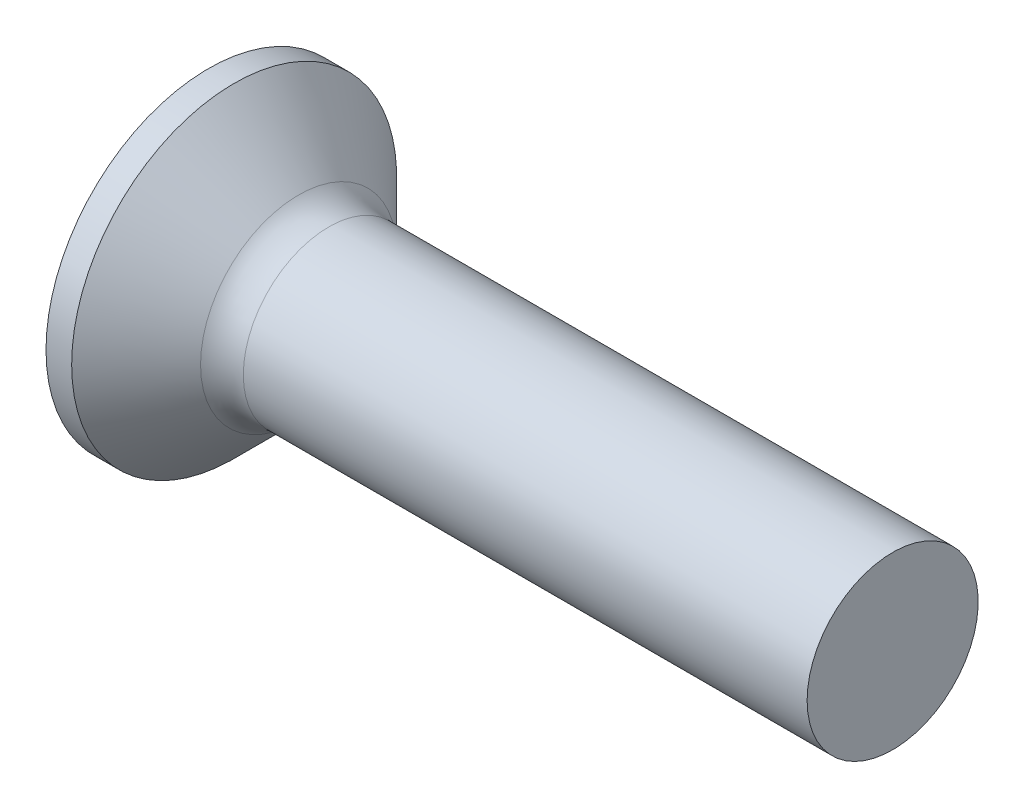
ISO-10303-21;
HEADER;
FILE_DESCRIPTION(('STEP AP214'),'2;1');
FILE_NAME('part.step','',(''),(''),'','','');
FILE_SCHEMA(('AUTOMOTIVE_DESIGN { 1 0 10303 214 1 1 1 1 }'));
ENDSEC;
DATA;
#1=APPLICATION_CONTEXT('core data for automotive mechanical design processes');
#2=APPLICATION_PROTOCOL_DEFINITION('international standard','automotive_design',2000,#1);
#3=PRODUCT_CONTEXT('',#1,'mechanical');
#4=PRODUCT('Part','Part','',(#3));
#5=PRODUCT_RELATED_PRODUCT_CATEGORY('part','',(#4));
#6=PRODUCT_DEFINITION_FORMATION('','',#4);
#7=PRODUCT_DEFINITION_CONTEXT('part definition',#1,'design');
#8=PRODUCT_DEFINITION('design','',#6,#7);
#9=PRODUCT_DEFINITION_SHAPE('','',#8);
#10=(LENGTH_UNIT() NAMED_UNIT(*) SI_UNIT(.MILLI.,.METRE.));
#11=(NAMED_UNIT(*) PLANE_ANGLE_UNIT() SI_UNIT($,.RADIAN.));
#12=(NAMED_UNIT(*) SI_UNIT($,.STERADIAN.) SOLID_ANGLE_UNIT());
#13=UNCERTAINTY_MEASURE_WITH_UNIT(LENGTH_MEASURE(1.E-05),#10,'distance_accuracy_value','');
#14=(GEOMETRIC_REPRESENTATION_CONTEXT(3) GLOBAL_UNCERTAINTY_ASSIGNED_CONTEXT((#13)) GLOBAL_UNIT_ASSIGNED_CONTEXT((#10,
#11,#12)) REPRESENTATION_CONTEXT('',''));
#15=CARTESIAN_POINT('',(0.,0.,0.));
#16=DIRECTION('',(0.,0.,1.));
#17=DIRECTION('',(1.,0.,0.));
#18=AXIS2_PLACEMENT_3D('',#15,#16,#17);
#19=CARTESIAN_POINT('',(0.,0.,0.));
#20=DIRECTION('',(-1.,0.,0.));
#21=DIRECTION('',(0.,0.,0.999999999999998));
#22=AXIS2_PLACEMENT_3D('',#19,#20,#21);
#23=PLANE('',#22);
#24=CARTESIAN_POINT('',(0.,0.,0.));
#25=DIRECTION('',(-1.,0.,0.));
#26=DIRECTION('',(0.,0.,0.999999999999998));
#27=AXIS2_PLACEMENT_3D('',#24,#25,#26);
#28=CIRCLE('',#27,1.9);
#29=CARTESIAN_POINT('',(0.,0.,1.9));
#30=VERTEX_POINT('',#29);
#31=EDGE_CURVE('E355',#30,#30,#28,.T.);
#32=ORIENTED_EDGE('',*,*,#31,.T.);
#33=EDGE_LOOP('',(#32));
#34=FACE_BOUND('',#33,.T.);
#35=DIRECTION('',(0.,0.,-0.999999999999999));
#36=VECTOR('',#35,1.);
#37=CARTESIAN_POINT('',(0.,-0.240000000000025,0.950000000000034));
#38=LINE('',#37,#36);
#39=CARTESIAN_POINT('',(0.,-0.240000000000025,0.950000000000034));
#40=VERTEX_POINT('',#39);
#41=CARTESIAN_POINT('',(0.,-0.240000000000004,0.368080234393747));
#42=VERTEX_POINT('',#41);
#43=EDGE_CURVE('E394',#40,#42,#38,.T.);
#44=ORIENTED_EDGE('',*,*,#43,.T.);
#45=CARTESIAN_POINT('',(0.,0.,0.));
#46=DIRECTION('',(-1.,0.,0.));
#47=DIRECTION('',(0.,0.,0.999999999999998));
#48=AXIS2_PLACEMENT_3D('',#45,#46,#47);
#49=CIRCLE('',#48,0.439412174332203);
#50=CARTESIAN_POINT('',(0.,-0.368080234393747,0.240000000000004));
#51=VERTEX_POINT('',#50);
#52=EDGE_CURVE('E381',#51,#42,#49,.T.);
#53=ORIENTED_EDGE('',*,*,#52,.F.);
#54=DIRECTION('',(0.,-0.999999999999999,0.));
#55=VECTOR('',#54,1.);
#56=CARTESIAN_POINT('',(0.,0.949999999999951,0.240000000000073));
#57=LINE('',#56,#55);
#58=CARTESIAN_POINT('',(0.,-0.950000000000076,0.240000000000087));
#59=VERTEX_POINT('',#58);
#60=EDGE_CURVE('E441',#51,#59,#57,.T.);
#61=ORIENTED_EDGE('',*,*,#60,.T.);
#62=DIRECTION('',(0.,0.,-0.999999999999998));
#63=VECTOR('',#62,1.);
#64=CARTESIAN_POINT('',(0.,-0.950000000000076,0.240000000000087));
#65=LINE('',#64,#63);
#66=CARTESIAN_POINT('',(0.,-0.950000000000041,-0.239999999999851));
#67=VERTEX_POINT('',#66);
#68=EDGE_CURVE('E352',#59,#67,#65,.T.);
#69=ORIENTED_EDGE('',*,*,#68,.T.);
#70=DIRECTION('',(0.,0.999999999999998,0.));
#71=VECTOR('',#70,1.);
#72=CARTESIAN_POINT('',(0.,-0.950000000000041,-0.239999999999851));
#73=LINE('',#72,#71);
#74=CARTESIAN_POINT('',(0.,-0.368080234393747,-0.23999999999999));
#75=VERTEX_POINT('',#74);
#76=EDGE_CURVE('E442',#67,#75,#73,.T.);
#77=ORIENTED_EDGE('',*,*,#76,.T.);
#78=CARTESIAN_POINT('',(0.,-0.240000000000046,-0.368080234393595));
#79=VERTEX_POINT('',#78);
#80=EDGE_CURVE('E387',#79,#75,#49,.T.);
#81=ORIENTED_EDGE('',*,*,#80,.F.);
#82=CARTESIAN_POINT('',(0.,-0.240000000000073,-0.949999999999881));
#83=VERTEX_POINT('',#82);
#84=EDGE_CURVE('E403',#79,#83,#38,.T.);
#85=ORIENTED_EDGE('',*,*,#84,.T.);
#86=DIRECTION('',(0.,0.999999999999998,0.));
#87=VECTOR('',#86,1.);
#88=CARTESIAN_POINT('',(0.,-0.240000000000073,-0.949999999999881));
#89=LINE('',#88,#87);
#90=CARTESIAN_POINT('',(0.,0.239999999999942,-0.94999999999984));
#91=VERTEX_POINT('',#90);
#92=EDGE_CURVE('E402',#83,#91,#89,.T.);
#93=ORIENTED_EDGE('',*,*,#92,.T.);
#94=DIRECTION('',(0.,0.,0.999999999999998));
#95=VECTOR('',#94,1.);
#96=CARTESIAN_POINT('',(0.,0.239999999999942,-0.94999999999984));
#97=LINE('',#96,#95);
#98=CARTESIAN_POINT('',(0.,0.239999999999949,-0.368080234393595));
#99=VERTEX_POINT('',#98);
#100=EDGE_CURVE('E409',#91,#99,#97,.T.);
#101=ORIENTED_EDGE('',*,*,#100,.T.);
#102=CARTESIAN_POINT('',(0.,0.368080234393706,-0.239999999999962));
#103=VERTEX_POINT('',#102);
#104=EDGE_CURVE('E477',#103,#99,#49,.T.);
#105=ORIENTED_EDGE('',*,*,#104,.F.);
#106=CARTESIAN_POINT('',(0.,0.94999999999993,-0.239999999999907));
#107=VERTEX_POINT('',#106);
#108=EDGE_CURVE('E450',#103,#107,#73,.T.);
#109=ORIENTED_EDGE('',*,*,#108,.T.);
#110=DIRECTION('',(0.,0.,0.999999999999998));
#111=VECTOR('',#110,1.);
#112=CARTESIAN_POINT('',(0.,0.94999999999993,-0.239999999999907));
#113=LINE('',#112,#111);
#114=CARTESIAN_POINT('',(0.,0.949999999999951,0.240000000000073));
#115=VERTEX_POINT('',#114);
#116=EDGE_CURVE('E438',#107,#115,#113,.T.);
#117=ORIENTED_EDGE('',*,*,#116,.T.);
#118=CARTESIAN_POINT('',(0.,0.368080234393706,0.240000000000046));
#119=VERTEX_POINT('',#118);
#120=EDGE_CURVE('E443',#115,#119,#57,.T.);
#121=ORIENTED_EDGE('',*,*,#120,.T.);
#122=CARTESIAN_POINT('',(0.,0.239999999999962,0.368080234393858));
#123=VERTEX_POINT('',#122);
#124=EDGE_CURVE('E389',#123,#119,#49,.T.);
#125=ORIENTED_EDGE('',*,*,#124,.F.);
#126=CARTESIAN_POINT('',(0.,0.239999999999976,0.950000000000159));
#127=VERTEX_POINT('',#126);
#128=EDGE_CURVE('E412',#123,#127,#97,.T.);
#129=ORIENTED_EDGE('',*,*,#128,.T.);
#130=DIRECTION('',(0.,-0.999999999999998,0.));
#131=VECTOR('',#130,1.);
#132=CARTESIAN_POINT('',(0.,0.239999999999976,0.950000000000159));
#133=LINE('',#132,#131);
#134=EDGE_CURVE('E401',#127,#40,#133,.T.);
#135=ORIENTED_EDGE('',*,*,#134,.T.);
#136=EDGE_LOOP('',(#44,#53,#61,#69,#77,#81,#85,#93,#101,#105,#109,#117,#121,#125,#129,#135));
#137=FACE_BOUND('',#136,.T.);
#138=ADVANCED_FACE('F48',(#34,#137),#23,.T.);
#139=CARTESIAN_POINT('',(1.2,-0.351702090980288,0.240000000000129));
#140=DIRECTION('',(0.,0.,-0.999999999999998));
#141=DIRECTION('',(-1.,0.,0.));
#142=AXIS2_PLACEMENT_3D('',#139,#140,#141);
#143=PLANE('',#142);
#144=ORIENTED_EDGE('',*,*,#60,.F.);
#145=CARTESIAN_POINT('',(-0.647693210410766,-0.421114336989034,0.240000000000157));
#146=CARTESIAN_POINT('',(-0.514503449530125,-0.410390261082066,0.240000000000117));
#147=CARTESIAN_POINT('',(-0.381320940222118,-0.399574318209556,0.240000000000118));
#148=CARTESIAN_POINT('',(-0.114973765651321,-0.377686644383797,0.240000000000139));
#149=CARTESIAN_POINT('',(0.0181908991098717,-0.366614907333412,0.240000000000159));
#150=CARTESIAN_POINT('',(0.284492634009299,-0.344144100394447,0.240000000000155));
#151=CARTESIAN_POINT('',(0.417629704158505,-0.332745030636268,0.240000000000132));
#152=CARTESIAN_POINT('',(0.683863247571623,-0.30950412250851,0.240000000000126));
#153=CARTESIAN_POINT('',(0.81695972144959,-0.297662291208926,0.240000000000144));
#154=CARTESIAN_POINT('',(1.04303435436914,-0.27701015453556,0.240000000000142));
#155=CARTESIAN_POINT('',(1.13602713244053,-0.268360479227187,0.240000000000132));
#156=CARTESIAN_POINT('',(1.3219725581858,-0.250648380042532,0.240000000000126));
#157=CARTESIAN_POINT('',(1.41492520621452,-0.241585959894602,0.240000000000129));
#158=CARTESIAN_POINT('',(1.60078125424124,-0.222904447219513,0.240000000000129));
#159=CARTESIAN_POINT('',(1.6936846508529,-0.213285320436343,0.240000000000127));
#160=CARTESIAN_POINT('',(1.87939874418318,-0.193166747196788,0.240000000000131));
#161=CARTESIAN_POINT('',(1.97220943765283,-0.182667270911502,0.240000000000138));
#162=CARTESIAN_POINT('',(2.06495176785102,-0.171565852394709,0.240000000000157));
#163=B_SPLINE_CURVE_WITH_KNOTS('',3,(#145,#146,#147,#148,#149,#150,#151,#152,#153,#154,#155,
#156,#157,#158,#159,#160,#161,#162),.UNSPECIFIED.,.F.,.F.,(4,2,2,2,2,2,2,2,4),(0.,
0.400862588720511,0.801734742318301,1.20260673621982,1.60347233174809,1.88365413958717,
2.16383341702736,2.44402995319874,2.72423598711459),.UNSPECIFIED.);
#164=CARTESIAN_POINT('',(1.2,-0.262259890185322,0.240000000000143));
#165=VERTEX_POINT('',#164);
#166=EDGE_CURVE('E384',#51,#165,#163,.T.);
#167=ORIENTED_EDGE('',*,*,#166,.T.);
#168=DIRECTION('',(0.,-0.999999999999998,0.));
#169=VECTOR('',#168,1.);
#170=CARTESIAN_POINT('',(1.2,0.351702090980129,0.240000000000073));
#171=LINE('',#170,#169);
#172=CARTESIAN_POINT('',(1.2,-0.351702090980288,0.240000000000129));
#173=VERTEX_POINT('',#172);
#174=EDGE_CURVE('E457',#165,#173,#171,.T.);
#175=ORIENTED_EDGE('',*,*,#174,.T.);
#176=DIRECTION('',(0.894934367749961,0.446197800778957,0.));
#177=VECTOR('',#176,1.);
#178=CARTESIAN_POINT('',(0.,-0.950000000000076,0.240000000000087));
#179=LINE('',#178,#177);
#180=EDGE_CURVE('E330',#59,#173,#179,.T.);
#181=ORIENTED_EDGE('',*,*,#180,.F.);
#182=EDGE_LOOP('',(#144,#167,#175,#181));
#183=FACE_BOUND('',#182,.T.);
#184=ADVANCED_FACE('F202',(#183),#143,.T.);
#185=CARTESIAN_POINT('',(1.2,0.351702090980129,0.240000000000073));
#186=VERTEX_POINT('',#185);
#187=CARTESIAN_POINT('',(1.2,0.26225989018526,0.240000000000143));
#188=VERTEX_POINT('',#187);
#189=EDGE_CURVE('E339',#186,#188,#171,.T.);
#190=ORIENTED_EDGE('',*,*,#189,.T.);
#191=CARTESIAN_POINT('',(-0.647693210410766,0.421114336988979,0.240000000000157));
#192=CARTESIAN_POINT('',(-0.514503449530114,0.410390261082132,0.240000000000148));
#193=CARTESIAN_POINT('',(-0.381320940222108,0.399574318209602,0.240000000000137));
#194=CARTESIAN_POINT('',(-0.114973765651318,0.377686644383749,0.24000000000012));
#195=CARTESIAN_POINT('',(0.0181908991098696,0.366614907333292,0.240000000000114));
#196=CARTESIAN_POINT('',(0.284492634009301,0.344144100394359,0.240000000000117));
#197=CARTESIAN_POINT('',(0.417629704158516,0.332745030636285,0.240000000000125));
#198=CARTESIAN_POINT('',(0.683863247571632,0.309504122508492,0.240000000000132));
#199=CARTESIAN_POINT('',(0.816959721449587,0.297662291208768,0.24000000000013));
#200=CARTESIAN_POINT('',(1.04303435436914,0.277010154535435,0.240000000000128));
#201=CARTESIAN_POINT('',(1.13602713244054,0.268360479227153,0.240000000000129));
#202=CARTESIAN_POINT('',(1.32197255818581,0.250648380042564,0.240000000000129));
#203=CARTESIAN_POINT('',(1.41492520621453,0.241585959894609,0.24000000000013));
#204=CARTESIAN_POINT('',(1.60078125424124,0.222904447219503,0.240000000000128));
#205=CARTESIAN_POINT('',(1.69368465085291,0.213285320436341,0.240000000000126));
#206=CARTESIAN_POINT('',(1.87939874418319,0.193166747196789,0.240000000000132));
#207=CARTESIAN_POINT('',(1.97220943765283,0.182667270911499,0.240000000000139));
#208=CARTESIAN_POINT('',(2.06495176785102,0.171565852394674,0.240000000000157));
#209=B_SPLINE_CURVE_WITH_KNOTS('',3,(#191,#192,#193,#194,#195,#196,#197,#198,#199,#200,#201,
#202,#203,#204,#205,#206,#207,#208),.UNSPECIFIED.,.F.,.F.,(4,2,2,2,2,2,2,2,4),(0.,
0.400862588720514,0.801734742318306,1.20260673621982,1.60347233174809,1.88365413958718,
2.16383341702737,2.44402995319874,2.72423598711459),.UNSPECIFIED.);
#210=EDGE_CURVE('E262',#188,#119,#209,.F.);
#211=ORIENTED_EDGE('',*,*,#210,.T.);
#212=ORIENTED_EDGE('',*,*,#120,.F.);
#213=DIRECTION('',(0.89493436774996,-0.446197800778958,0.));
#214=VECTOR('',#213,1.);
#215=CARTESIAN_POINT('',(0.,0.949999999999951,0.240000000000073));
#216=LINE('',#215,#214);
#217=EDGE_CURVE('E71',#115,#186,#216,.T.);
#218=ORIENTED_EDGE('',*,*,#217,.T.);
#219=EDGE_LOOP('',(#190,#211,#212,#218));
#220=FACE_BOUND('',#219,.T.);
#221=ADVANCED_FACE('F207',(#220),#143,.T.);
#222=CARTESIAN_POINT('',(1.2,0.351702090980177,-0.239999999999851));
#223=DIRECTION('',(0.,0.,0.999999999999998));
#224=DIRECTION('',(1.,0.,0.));
#225=AXIS2_PLACEMENT_3D('',#222,#223,#224);
#226=PLANE('',#225);
#227=DIRECTION('',(0.,0.999999999999998,0.));
#228=VECTOR('',#227,1.);
#229=CARTESIAN_POINT('',(1.2,-0.351702090980219,-0.239999999999949));
#230=LINE('',#229,#228);
#231=CARTESIAN_POINT('',(1.2,-0.351702090980219,-0.239999999999949));
#232=VERTEX_POINT('',#231);
#233=CARTESIAN_POINT('',(1.2,-0.262259890185343,-0.239999999999935));
#234=VERTEX_POINT('',#233);
#235=EDGE_CURVE('E343',#232,#234,#230,.T.);
#236=ORIENTED_EDGE('',*,*,#235,.T.);
#237=CARTESIAN_POINT('',(-0.647693210410766,-0.421114336989083,-0.239999999999879));
#238=CARTESIAN_POINT('',(-0.514503449530105,-0.410390261082349,-0.239999999999857));
#239=CARTESIAN_POINT('',(-0.3813209402221,-0.399574318209808,-0.239999999999851));
#240=CARTESIAN_POINT('',(-0.114973765651315,-0.377686644383886,-0.23999999999985));
#241=CARTESIAN_POINT('',(0.0181908991098679,-0.366614907333371,-0.239999999999854));
#242=CARTESIAN_POINT('',(0.284492634009302,-0.344144100394475,-0.239999999999848));
#243=CARTESIAN_POINT('',(0.417629704158526,-0.332745030636496,-0.239999999999838));
#244=CARTESIAN_POINT('',(0.68386324757164,-0.309504122508695,-0.239999999999864));
#245=CARTESIAN_POINT('',(0.816959721449585,-0.297662291208868,-0.239999999999901));
#246=CARTESIAN_POINT('',(1.04303435436914,-0.277010154535577,-0.239999999999888));
#247=CARTESIAN_POINT('',(1.13602713244055,-0.268360479227375,-0.239999999999861));
#248=CARTESIAN_POINT('',(1.32197255818583,-0.250648380042852,-0.239999999999842));
#249=CARTESIAN_POINT('',(1.41492520621455,-0.241585959894883,-0.239999999999849));
#250=CARTESIAN_POINT('',(1.60078125424126,-0.222904447219799,-0.239999999999854));
#251=CARTESIAN_POINT('',(1.69368465085293,-0.213285320436674,-0.23999999999985));
#252=CARTESIAN_POINT('',(1.87939874418321,-0.193166747197106,-0.239999999999853));
#253=CARTESIAN_POINT('',(1.97220943765285,-0.182667270911764,-0.239999999999859));
#254=CARTESIAN_POINT('',(2.06495176785102,-0.171565852394771,-0.239999999999879));
#255=B_SPLINE_CURVE_WITH_KNOTS('',3,(#237,#238,#239,#240,#241,#242,#243,#244,#245,#246,#247,
#248,#249,#250,#251,#252,#253,#254),.UNSPECIFIED.,.F.,.F.,(4,2,2,2,2,2,2,2,4),(0.,
0.400862588720514,0.801734742318306,1.20260673621982,1.60347233174809,1.88365413958718,
2.16383341702737,2.44402995319874,2.72423598711459),.UNSPECIFIED.);
#256=EDGE_CURVE('E256',#234,#75,#255,.F.);
#257=ORIENTED_EDGE('',*,*,#256,.T.);
#258=ORIENTED_EDGE('',*,*,#76,.F.);
#259=DIRECTION('',(0.894934367749961,0.446197800778957,0.));
#260=VECTOR('',#259,1.);
#261=CARTESIAN_POINT('',(0.,-0.950000000000041,-0.239999999999851));
#262=LINE('',#261,#260);
#263=EDGE_CURVE('E452',#67,#232,#262,.T.);
#264=ORIENTED_EDGE('',*,*,#263,.T.);
#265=EDGE_LOOP('',(#236,#257,#258,#264));
#266=FACE_BOUND('',#265,.T.);
#267=ADVANCED_FACE('F242',(#266),#226,.T.);
#268=ORIENTED_EDGE('',*,*,#108,.F.);
#269=CARTESIAN_POINT('',(-0.647693210410766,0.421114336988979,-0.239999999999851));
#270=CARTESIAN_POINT('',(-0.514503449530098,0.41039026108234,-0.239999999999739));
#271=CARTESIAN_POINT('',(-0.381320940222093,0.399574318209815,-0.239999999999783));
#272=CARTESIAN_POINT('',(-0.114973765651311,0.377686644383878,-0.239999999999918));
#273=CARTESIAN_POINT('',(0.0181908991098684,0.366614907333333,-0.240000000000009));
#274=CARTESIAN_POINT('',(0.284492634009303,0.344144100394443,-0.239999999999971));
#275=CARTESIAN_POINT('',(0.41762970415853,0.332745030636501,-0.239999999999842));
#276=CARTESIAN_POINT('',(0.683863247571643,0.309504122508688,-0.23999999999986));
#277=CARTESIAN_POINT('',(0.816959721449584,0.297662291208812,-0.240000000000008));
#278=CARTESIAN_POINT('',(1.04303435436914,0.277010154535534,-0.239999999999978));
#279=CARTESIAN_POINT('',(1.13602713244055,0.268360479227364,-0.239999999999886));
#280=CARTESIAN_POINT('',(1.32197255818584,0.250648380042863,-0.239999999999817));
#281=CARTESIAN_POINT('',(1.41492520621456,0.241585959894883,-0.239999999999842));
#282=CARTESIAN_POINT('',(1.60078125424127,0.222904447219798,-0.239999999999861));
#283=CARTESIAN_POINT('',(1.69368465085294,0.213285320436682,-0.239999999999857));
#284=CARTESIAN_POINT('',(1.87939874418322,0.193166747197095,-0.239999999999847));
#285=CARTESIAN_POINT('',(1.97220943765285,0.182667270911724,-0.239999999999842));
#286=CARTESIAN_POINT('',(2.06495176785102,0.171565852394653,-0.239999999999851));
#287=B_SPLINE_CURVE_WITH_KNOTS('',3,(#269,#270,#271,#272,#273,#274,#275,#276,#277,#278,#279,
#280,#281,#282,#283,#284,#285,#286),.UNSPECIFIED.,.F.,.F.,(4,2,2,2,2,2,2,2,4),(0.,
0.400862588720511,0.801734742318301,1.20260673621982,1.60347233174809,1.88365413958718,
2.16383341702737,2.44402995319874,2.7242359871146),.UNSPECIFIED.);
#288=CARTESIAN_POINT('',(1.2,0.262259890185246,-0.239999999999935));
#289=VERTEX_POINT('',#288);
#290=EDGE_CURVE('E250',#103,#289,#287,.T.);
#291=ORIENTED_EDGE('',*,*,#290,.T.);
#292=CARTESIAN_POINT('',(1.2,0.351702090980177,-0.239999999999851));
#293=VERTEX_POINT('',#292);
#294=EDGE_CURVE('E347',#289,#293,#230,.T.);
#295=ORIENTED_EDGE('',*,*,#294,.T.);
#296=DIRECTION('',(0.89493436774996,-0.446197800778958,0.));
#297=VECTOR('',#296,1.);
#298=CARTESIAN_POINT('',(0.,0.94999999999993,-0.239999999999907));
#299=LINE('',#298,#297);
#300=EDGE_CURVE('E334',#107,#293,#299,.T.);
#301=ORIENTED_EDGE('',*,*,#300,.F.);
#302=EDGE_LOOP('',(#268,#291,#295,#301));
#303=FACE_BOUND('',#302,.T.);
#304=ADVANCED_FACE('F234',(#303),#226,.T.);
#305=CARTESIAN_POINT('',(1.2,0.351702090980177,-0.239999999999851));
#306=DIRECTION('',(1.,0.,0.));
#307=DIRECTION('',(0.,0.,-0.999999999999998));
#308=AXIS2_PLACEMENT_3D('',#305,#306,#307);
#309=PLANE('',#308);
#310=CARTESIAN_POINT('',(1.2,0.,0.));
#311=DIRECTION('',(-1.,0.,0.));
#312=DIRECTION('',(0.,0.,0.999999999999998));
#313=AXIS2_PLACEMENT_3D('',#310,#311,#312);
#314=CIRCLE('',#313,0.355499999999999);
#315=CARTESIAN_POINT('',(1.2,-0.0518255651213995,-0.351702090980108));
#316=VERTEX_POINT('',#315);
#317=CARTESIAN_POINT('',(1.2,-0.240000000000018,-0.262259890185176));
#318=VERTEX_POINT('',#317);
#319=EDGE_CURVE('E524',#316,#318,#314,.T.);
#320=ORIENTED_EDGE('',*,*,#319,.F.);
#321=DIRECTION('',(0.,0.999999999999998,0.));
#322=VECTOR('',#321,1.);
#323=CARTESIAN_POINT('',(1.2,-0.24000000000006,-0.351702090980094));
#324=LINE('',#323,#322);
#325=CARTESIAN_POINT('',(1.2,-0.24000000000006,-0.351702090980094));
#326=VERTEX_POINT('',#325);
#327=EDGE_CURVE('E424',#326,#316,#324,.T.);
#328=ORIENTED_EDGE('',*,*,#327,.F.);
#329=DIRECTION('',(0.,0.,-0.999999999999999));
#330=VECTOR('',#329,1.);
#331=CARTESIAN_POINT('',(1.2,-0.240000000000004,0.351702090980219));
#332=LINE('',#331,#330);
#333=EDGE_CURVE('E428',#318,#326,#332,.T.);
#334=ORIENTED_EDGE('',*,*,#333,.F.);
#335=EDGE_LOOP('',(#320,#328,#334));
#336=FACE_BOUND('',#335,.T.);
#337=ADVANCED_FACE('F230',(#336),#309,.F.);
#338=CARTESIAN_POINT('',(1.2,-0.351702090980247,-0.0518255651211913));
#339=VERTEX_POINT('',#338);
#340=EDGE_CURVE('E495',#234,#339,#314,.T.);
#341=ORIENTED_EDGE('',*,*,#340,.F.);
#342=ORIENTED_EDGE('',*,*,#235,.F.);
#343=DIRECTION('',(0.,0.,-0.999999999999998));
#344=VECTOR('',#343,1.);
#345=CARTESIAN_POINT('',(1.2,-0.351702090980288,0.240000000000129));
#346=LINE('',#345,#344);
#347=EDGE_CURVE('E335',#339,#232,#346,.T.);
#348=ORIENTED_EDGE('',*,*,#347,.F.);
#349=EDGE_LOOP('',(#341,#342,#348));
#350=FACE_BOUND('',#349,.T.);
#351=ADVANCED_FACE('F233',(#350),#309,.F.);
#352=CARTESIAN_POINT('',(1.2,-0.351702090980247,0.051825565121455));
#353=VERTEX_POINT('',#352);
#354=EDGE_CURVE('E491',#353,#165,#314,.T.);
#355=ORIENTED_EDGE('',*,*,#354,.F.);
#356=EDGE_CURVE('E325',#173,#353,#346,.T.);
#357=ORIENTED_EDGE('',*,*,#356,.F.);
#358=ORIENTED_EDGE('',*,*,#174,.F.);
#359=EDGE_LOOP('',(#355,#357,#358));
#360=FACE_BOUND('',#359,.T.);
#361=ADVANCED_FACE('F489',(#360),#309,.F.);
#362=CARTESIAN_POINT('',(1.2,-0.240000000000004,0.262259890185371));
#363=VERTEX_POINT('',#362);
#364=CARTESIAN_POINT('',(1.2,-0.0518255651213578,0.351702090980219));
#365=VERTEX_POINT('',#364);
#366=EDGE_CURVE('E63',#363,#365,#314,.T.);
#367=ORIENTED_EDGE('',*,*,#366,.F.);
#368=CARTESIAN_POINT('',(1.2,-0.240000000000004,0.351702090980219));
#369=VERTEX_POINT('',#368);
#370=EDGE_CURVE('E397',#369,#363,#332,.T.);
#371=ORIENTED_EDGE('',*,*,#370,.F.);
#372=DIRECTION('',(0.,-0.999999999999998,0.));
#373=VECTOR('',#372,1.);
#374=CARTESIAN_POINT('',(1.2,0.239999999999962,0.351702090980344));
#375=LINE('',#374,#373);
#376=EDGE_CURVE('E429',#365,#369,#375,.T.);
#377=ORIENTED_EDGE('',*,*,#376,.F.);
#378=EDGE_LOOP('',(#367,#371,#377));
#379=FACE_BOUND('',#378,.T.);
#380=ADVANCED_FACE('F535',(#379),#309,.F.);
#381=CARTESIAN_POINT('',(1.2,0.0518255651213093,0.351702090980358));
#382=VERTEX_POINT('',#381);
#383=CARTESIAN_POINT('',(1.2,0.239999999999976,0.262259890185329));
#384=VERTEX_POINT('',#383);
#385=EDGE_CURVE('E388',#382,#384,#314,.T.);
#386=ORIENTED_EDGE('',*,*,#385,.F.);
#387=CARTESIAN_POINT('',(1.2,0.239999999999962,0.351702090980344));
#388=VERTEX_POINT('',#387);
#389=EDGE_CURVE('E425',#388,#382,#375,.T.);
#390=ORIENTED_EDGE('',*,*,#389,.F.);
#391=DIRECTION('',(0.,0.,0.999999999999998));
#392=VECTOR('',#391,1.);
#393=CARTESIAN_POINT('',(1.2,0.239999999999962,-0.351702090980066));
#394=LINE('',#393,#392);
#395=EDGE_CURVE('E437',#384,#388,#394,.T.);
#396=ORIENTED_EDGE('',*,*,#395,.F.);
#397=EDGE_LOOP('',(#386,#390,#396));
#398=FACE_BOUND('',#397,.T.);
#399=ADVANCED_FACE('F500',(#398),#309,.F.);
#400=CARTESIAN_POINT('',(1.2,0.351702090980191,0.0518255651213995));
#401=VERTEX_POINT('',#400);
#402=EDGE_CURVE('E469',#188,#401,#314,.T.);
#403=ORIENTED_EDGE('',*,*,#402,.F.);
#404=ORIENTED_EDGE('',*,*,#189,.F.);
#405=DIRECTION('',(0.,0.,0.999999999999998));
#406=VECTOR('',#405,1.);
#407=CARTESIAN_POINT('',(1.2,0.351702090980177,-0.239999999999851));
#408=LINE('',#407,#406);
#409=EDGE_CURVE('E346',#401,#186,#408,.T.);
#410=ORIENTED_EDGE('',*,*,#409,.F.);
#411=EDGE_LOOP('',(#403,#404,#410));
#412=FACE_BOUND('',#411,.T.);
#413=ADVANCED_FACE('F467',(#412),#309,.F.);
#414=CARTESIAN_POINT('',(1.2,0.351702090980205,-0.0518255651213023));
#415=VERTEX_POINT('',#414);
#416=EDGE_CURVE('E475',#415,#289,#314,.T.);
#417=ORIENTED_EDGE('',*,*,#416,.F.);
#418=EDGE_CURVE('E455',#293,#415,#408,.T.);
#419=ORIENTED_EDGE('',*,*,#418,.F.);
#420=ORIENTED_EDGE('',*,*,#294,.F.);
#421=EDGE_LOOP('',(#417,#419,#420));
#422=FACE_BOUND('',#421,.T.);
#423=ADVANCED_FACE('F319',(#422),#309,.F.);
#424=CARTESIAN_POINT('',(1.2,0.239999999999935,-0.26225989018519));
#425=VERTEX_POINT('',#424);
#426=CARTESIAN_POINT('',(1.2,0.051825565121344,-0.351702090980177));
#427=VERTEX_POINT('',#426);
#428=EDGE_CURVE('E518',#425,#427,#314,.T.);
#429=ORIENTED_EDGE('',*,*,#428,.F.);
#430=CARTESIAN_POINT('',(1.2,0.239999999999962,-0.351702090980066));
#431=VERTEX_POINT('',#430);
#432=EDGE_CURVE('E434',#431,#425,#394,.T.);
#433=ORIENTED_EDGE('',*,*,#432,.F.);
#434=EDGE_CURVE('E431',#427,#431,#324,.T.);
#435=ORIENTED_EDGE('',*,*,#434,.F.);
#436=EDGE_LOOP('',(#429,#433,#435));
#437=FACE_BOUND('',#436,.T.);
#438=ADVANCED_FACE('F236',(#437),#309,.F.);
#439=CARTESIAN_POINT('',(1.2,-0.351702090980219,-0.239999999999949));
#440=DIRECTION('',(-0.446197800778957,0.894934367749959,0.));
#441=DIRECTION('',(-0.894934367749961,-0.446197800778957,0.));
#442=AXIS2_PLACEMENT_3D('',#439,#440,#441);
#443=PLANE('',#442);
#444=ORIENTED_EDGE('',*,*,#356,.T.);
#445=CARTESIAN_POINT('',(1.81755030037573,-0.0438028797890982,0.));
#446=DIRECTION('',(-0.446197800778957,0.894934367749959,0.));
#447=DIRECTION('',(-0.894934367749961,-0.446197800778957,0.));
#448=AXIS2_PLACEMENT_3D('',#445,#446,#447);
#449=ELLIPSE('',#448,0.699951178008363,0.309229710740658);
#450=EDGE_CURVE('E326',#353,#339,#449,.F.);
#451=ORIENTED_EDGE('',*,*,#450,.T.);
#452=ORIENTED_EDGE('',*,*,#347,.T.);
#453=ORIENTED_EDGE('',*,*,#263,.F.);
#454=ORIENTED_EDGE('',*,*,#68,.F.);
#455=ORIENTED_EDGE('',*,*,#180,.T.);
#456=EDGE_LOOP('',(#444,#451,#452,#453,#454,#455));
#457=FACE_BOUND('',#456,.T.);
#458=ADVANCED_FACE('F241',(#457),#443,.T.);
#459=CARTESIAN_POINT('',(0.,0.949999999999951,0.240000000000073));
#460=DIRECTION('',(-0.446197800778958,-0.894934367749959,0.));
#461=DIRECTION('',(0.89493436774996,-0.446197800778958,0.));
#462=AXIS2_PLACEMENT_3D('',#459,#460,#461);
#463=PLANE('',#462);
#464=ORIENTED_EDGE('',*,*,#418,.T.);
#465=CARTESIAN_POINT('',(1.81755030037573,0.043802879789015,1.11022302462516E-13));
#466=DIRECTION('',(-0.446197800778958,-0.894934367749959,0.));
#467=DIRECTION('',(-0.89493436774996,0.446197800778958,0.));
#468=AXIS2_PLACEMENT_3D('',#465,#466,#467);
#469=ELLIPSE('',#468,0.699951178008361,0.309229710740658);
#470=EDGE_CURVE('E303',#415,#401,#469,.F.);
#471=ORIENTED_EDGE('',*,*,#470,.T.);
#472=ORIENTED_EDGE('',*,*,#409,.T.);
#473=ORIENTED_EDGE('',*,*,#217,.F.);
#474=ORIENTED_EDGE('',*,*,#116,.F.);
#475=ORIENTED_EDGE('',*,*,#300,.T.);
#476=EDGE_LOOP('',(#464,#471,#472,#473,#474,#475));
#477=FACE_BOUND('',#476,.T.);
#478=ADVANCED_FACE('F237',(#477),#463,.T.);
#479=CARTESIAN_POINT('',(1.2,0.239999999999962,0.351702090980344));
#480=DIRECTION('',(0.,-0.999999999999998,0.));
#481=DIRECTION('',(1.,0.,0.));
#482=AXIS2_PLACEMENT_3D('',#479,#480,#481);
#483=PLANE('',#482);
#484=ORIENTED_EDGE('',*,*,#432,.T.);
#485=CARTESIAN_POINT('',(-0.647693210410766,0.239999999999976,-0.421114336988965));
#486=CARTESIAN_POINT('',(-0.514503449530096,0.239999999999966,-0.410390261082335));
#487=CARTESIAN_POINT('',(-0.381320940222091,0.239999999999964,-0.399574318209778));
#488=CARTESIAN_POINT('',(-0.114973765651311,0.239999999999965,-0.377686644383774));
#489=CARTESIAN_POINT('',(0.0181908991098664,0.239999999999968,-0.366614907333193));
#490=CARTESIAN_POINT('',(0.284492634009302,0.239999999999971,-0.344144100394306));
#491=CARTESIAN_POINT('',(0.417629704158532,0.239999999999971,-0.332745030636402));
#492=CARTESIAN_POINT('',(0.683863247571646,0.239999999999958,-0.309504122508617));
#493=CARTESIAN_POINT('',(0.816959721449586,0.239999999999945,-0.29766229120873));
#494=CARTESIAN_POINT('',(1.04303435436914,0.239999999999951,-0.277010154535438));
#495=CARTESIAN_POINT('',(1.13602713244055,0.239999999999961,-0.268360479227263));
#496=CARTESIAN_POINT('',(1.32197255818584,0.239999999999968,-0.250648380042754));
#497=CARTESIAN_POINT('',(1.41492520621455,0.239999999999966,-0.241585959894771));
#498=CARTESIAN_POINT('',(1.60078125424127,0.239999999999964,-0.222904447219676));
#499=CARTESIAN_POINT('',(1.69368465085294,0.239999999999964,-0.213285320436553));
#500=CARTESIAN_POINT('',(1.87939874418322,0.239999999999965,-0.193166747196959));
#501=CARTESIAN_POINT('',(1.97220943765285,0.239999999999965,-0.182667270911588));
#502=CARTESIAN_POINT('',(2.06495176785102,0.239999999999962,-0.171565852394528));
#503=B_SPLINE_CURVE_WITH_KNOTS('',3,(#485,#486,#487,#488,#489,#490,#491,#492,#493,#494,#495,
#496,#497,#498,#499,#500,#501,#502),.UNSPECIFIED.,.F.,.F.,(4,2,2,2,2,2,2,2,4),(0.,
0.400862588720516,0.801734742318311,1.20260673621983,1.60347233174809,1.88365413958718,
2.16383341702738,2.44402995319875,2.72423598711461),.UNSPECIFIED.);
#504=EDGE_CURVE('E296',#425,#99,#503,.F.);
#505=ORIENTED_EDGE('',*,*,#504,.T.);
#506=ORIENTED_EDGE('',*,*,#100,.F.);
#507=DIRECTION('',(0.894934367749961,0.,0.446197800778956));
#508=VECTOR('',#507,1.);
#509=CARTESIAN_POINT('',(0.,0.239999999999942,-0.94999999999984));
#510=LINE('',#509,#508);
#511=EDGE_CURVE('E416',#91,#431,#510,.T.);
#512=ORIENTED_EDGE('',*,*,#511,.T.);
#513=EDGE_LOOP('',(#484,#505,#506,#512));
#514=FACE_BOUND('',#513,.T.);
#515=ADVANCED_FACE('F240',(#514),#483,.T.);
#516=CARTESIAN_POINT('',(1.2,-0.24000000000006,-0.351702090980094));
#517=DIRECTION('',(0.,0.999999999999999,0.));
#518=DIRECTION('',(-1.,0.,0.));
#519=AXIS2_PLACEMENT_3D('',#516,#517,#518);
#520=PLANE('',#519);
#521=ORIENTED_EDGE('',*,*,#84,.F.);
#522=CARTESIAN_POINT('',(-0.647693210421636,-0.240000000000032,-0.421114336989728));
#523=CARTESIAN_POINT('',(-0.514503449539808,-0.240000000000064,-0.410390261082983));
#524=CARTESIAN_POINT('',(-0.38132094023064,-0.240000000000065,-0.399574318210376));
#525=CARTESIAN_POINT('',(-0.114973765657534,-0.240000000000053,-0.377686644384273));
#526=CARTESIAN_POINT('',(0.0181908991048074,-0.240000000000041,-0.366614907333642));
#527=CARTESIAN_POINT('',(0.284492634007952,-0.240000000000051,-0.344144100394405));
#528=CARTESIAN_POINT('',(0.417629704159727,-0.240000000000074,-0.332745030636198));
#529=CARTESIAN_POINT('',(0.68386324757795,-0.240000000000046,-0.309504122508025));
#530=CARTESIAN_POINT('',(0.816959721458454,-0.239999999999995,-0.297662291208054));
#531=CARTESIAN_POINT('',(1.04303435438055,-0.240000000000011,-0.277010154534446));
#532=CARTESIAN_POINT('',(1.13602713245195,-0.240000000000047,-0.268360479226147));
#533=CARTESIAN_POINT('',(1.32197255819723,-0.240000000000073,-0.250648380041523));
#534=CARTESIAN_POINT('',(1.41492520622594,-0.240000000000063,-0.241585959893548));
#535=CARTESIAN_POINT('',(1.60078125425266,-0.240000000000057,-0.222904447218412));
#536=CARTESIAN_POINT('',(1.69368465086432,-0.24000000000006,-0.213285320435238));
#537=CARTESIAN_POINT('',(1.87939874419459,-0.240000000000061,-0.193166747195585));
#538=CARTESIAN_POINT('',(1.97220943766423,-0.240000000000059,-0.182667270910207));
#539=CARTESIAN_POINT('',(2.0649517678624,-0.240000000000046,-0.17156585239321));
#540=B_SPLINE_CURVE_WITH_KNOTS('',3,(#522,#523,#524,#525,#526,#527,#528,#529,#530,#531,#532,
#533,#534,#535,#536,#537,#538,#539),.UNSPECIFIED.,.F.,.F.,(4,2,2,2,2,2,2,2,4),(0.,
0.400862588724006,0.801734742325291,1.20260673623449,1.60347233177044,1.88365413960953,
2.16383341704972,2.4440299532211,2.72423598713696),.UNSPECIFIED.);
#541=EDGE_CURVE('E290',#79,#318,#540,.T.);
#542=ORIENTED_EDGE('',*,*,#541,.T.);
#543=ORIENTED_EDGE('',*,*,#333,.T.);
#544=DIRECTION('',(0.894934367749961,0.,0.446197800778956));
#545=VECTOR('',#544,1.);
#546=CARTESIAN_POINT('',(0.,-0.240000000000073,-0.949999999999881));
#547=LINE('',#546,#545);
#548=EDGE_CURVE('E413',#83,#326,#547,.T.);
#549=ORIENTED_EDGE('',*,*,#548,.F.);
#550=EDGE_LOOP('',(#521,#542,#543,#549));
#551=FACE_BOUND('',#550,.T.);
#552=ADVANCED_FACE('F307',(#551),#520,.T.);
#553=CARTESIAN_POINT('',(1.2,0.239999999999962,-0.351702090980066));
#554=DIRECTION('',(-0.446197800778957,0.,0.894934367749959));
#555=DIRECTION('',(-0.894934367749961,0.,-0.446197800778956));
#556=AXIS2_PLACEMENT_3D('',#553,#554,#555);
#557=PLANE('',#556);
#558=ORIENTED_EDGE('',*,*,#327,.T.);
#559=CARTESIAN_POINT('',(1.81755030037573,0.,-0.0438028797890011));
#560=DIRECTION('',(-0.446197800778957,0.,0.894934367749959));
#561=DIRECTION('',(-0.894934367749961,0.,-0.446197800778956));
#562=AXIS2_PLACEMENT_3D('',#559,#560,#561);
#563=ELLIPSE('',#562,0.699951178008363,0.309229710740658);
#564=EDGE_CURVE('E398',#316,#427,#563,.F.);
#565=ORIENTED_EDGE('',*,*,#564,.T.);
#566=ORIENTED_EDGE('',*,*,#434,.T.);
#567=ORIENTED_EDGE('',*,*,#511,.F.);
#568=ORIENTED_EDGE('',*,*,#92,.F.);
#569=ORIENTED_EDGE('',*,*,#548,.T.);
#570=EDGE_LOOP('',(#558,#565,#566,#567,#568,#569));
#571=FACE_BOUND('',#570,.T.);
#572=ADVANCED_FACE('F269',(#571),#557,.T.);
#573=ORIENTED_EDGE('',*,*,#370,.T.);
#574=CARTESIAN_POINT('',(-0.647693210410766,-0.240000000000018,0.421114336989006));
#575=CARTESIAN_POINT('',(-0.514503449530127,-0.240000000000048,0.41039026108204));
#576=CARTESIAN_POINT('',(-0.381320940222119,-0.240000000000058,0.399574318209564));
#577=CARTESIAN_POINT('',(-0.11497376565132,-0.240000000000065,0.377686644383872));
#578=CARTESIAN_POINT('',(0.0181908991098736,-0.240000000000063,0.366614907333521));
#579=CARTESIAN_POINT('',(0.2844926340093,-0.24000000000007,0.34414410039456));
#580=CARTESIAN_POINT('',(0.417629704158505,-0.240000000000081,0.332745030636351));
#581=CARTESIAN_POINT('',(0.683863247571621,-0.240000000000042,0.309504122508528));
#582=CARTESIAN_POINT('',(0.816959721449586,-0.239999999999993,0.29766229120891));
#583=CARTESIAN_POINT('',(1.04303435436914,-0.240000000000012,0.277010154535572));
#584=CARTESIAN_POINT('',(1.13602713244053,-0.240000000000048,0.268360479227234));
#585=CARTESIAN_POINT('',(1.3219725581858,-0.240000000000075,0.250648380042609));
#586=CARTESIAN_POINT('',(1.41492520621452,-0.240000000000065,0.241585959894673));
#587=CARTESIAN_POINT('',(1.60078125424124,-0.240000000000058,0.222904447219581));
#588=CARTESIAN_POINT('',(1.6936846508529,-0.24000000000006,0.213285320436413));
#589=CARTESIAN_POINT('',(1.87939874418318,-0.240000000000063,0.193166747196878));
#590=CARTESIAN_POINT('',(1.97220943765282,-0.240000000000065,0.182667270911611));
#591=CARTESIAN_POINT('',(2.06495176785102,-0.24000000000006,0.171565852394848));
#592=B_SPLINE_CURVE_WITH_KNOTS('',3,(#574,#575,#576,#577,#578,#579,#580,#581,#582,#583,#584,
#585,#586,#587,#588,#589,#590,#591),.UNSPECIFIED.,.F.,.F.,(4,2,2,2,2,2,2,2,4),(0.,
0.400862588720506,0.80173474231829,1.20260673621981,1.60347233174808,1.88365413958717,
2.16383341702736,2.44402995319872,2.72423598711457),.UNSPECIFIED.);
#593=EDGE_CURVE('E283',#363,#42,#592,.F.);
#594=ORIENTED_EDGE('',*,*,#593,.T.);
#595=ORIENTED_EDGE('',*,*,#43,.F.);
#596=DIRECTION('',(0.89493436774996,0.,-0.446197800778958));
#597=VECTOR('',#596,1.);
#598=CARTESIAN_POINT('',(0.,-0.240000000000025,0.950000000000034));
#599=LINE('',#598,#597);
#600=EDGE_CURVE('E419',#40,#369,#599,.T.);
#601=ORIENTED_EDGE('',*,*,#600,.T.);
#602=EDGE_LOOP('',(#573,#594,#595,#601));
#603=FACE_BOUND('',#602,.T.);
#604=ADVANCED_FACE('F392',(#603),#520,.T.);
#605=ORIENTED_EDGE('',*,*,#128,.F.);
#606=CARTESIAN_POINT('',(-0.647693210421636,0.239999999999935,0.421114336989964));
#607=CARTESIAN_POINT('',(-0.514503449539823,0.23999999999993,0.410390261083027));
#608=CARTESIAN_POINT('',(-0.381320940230655,0.239999999999946,0.399574318210406));
#609=CARTESIAN_POINT('',(-0.114973765657542,0.239999999999977,0.377686644384366));
#610=CARTESIAN_POINT('',(0.0181908991048069,0.239999999999993,0.366614907333813));
#611=CARTESIAN_POINT('',(0.284492634007951,0.239999999999987,0.344144100394567));
#612=CARTESIAN_POINT('',(0.417629704159719,0.239999999999965,0.332745030636273));
#613=CARTESIAN_POINT('',(0.683863247577943,0.23999999999996,0.309504122508097));
#614=CARTESIAN_POINT('',(0.816959721458454,0.239999999999977,0.29766229120821));
#615=CARTESIAN_POINT('',(1.04303435438055,0.239999999999976,0.277010154534597));
#616=CARTESIAN_POINT('',(1.13602713245195,0.239999999999966,0.268360479226253));
#617=CARTESIAN_POINT('',(1.32197255819722,0.23999999999996,0.250648380041599));
#618=CARTESIAN_POINT('',(1.41492520622594,0.239999999999963,0.24158595989364));
#619=CARTESIAN_POINT('',(1.60078125425265,0.239999999999963,0.222904447218521));
#620=CARTESIAN_POINT('',(1.69368465086432,0.239999999999961,0.21328532043535));
#621=CARTESIAN_POINT('',(1.87939874419459,0.239999999999965,0.193166747195702));
#622=CARTESIAN_POINT('',(1.97220943766423,0.239999999999972,0.182667270910325));
#623=CARTESIAN_POINT('',(2.0649517678624,0.23999999999999,0.171565852393335));
#624=B_SPLINE_CURVE_WITH_KNOTS('',3,(#606,#607,#608,#609,#610,#611,#612,#613,#614,#615,#616,
#617,#618,#619,#620,#621,#622,#623),.UNSPECIFIED.,.F.,.F.,(4,2,2,2,2,2,2,2,4),(0.,
0.400862588724008,0.801734742325297,1.2026067362345,1.60347233177045,1.88365413960954,
2.16383341704973,2.44402995322111,2.72423598713696),.UNSPECIFIED.);
#625=EDGE_CURVE('E274',#123,#384,#624,.T.);
#626=ORIENTED_EDGE('',*,*,#625,.T.);
#627=ORIENTED_EDGE('',*,*,#395,.T.);
#628=DIRECTION('',(0.89493436774996,0.,-0.446197800778958));
#629=VECTOR('',#628,1.);
#630=CARTESIAN_POINT('',(0.,0.239999999999976,0.950000000000159));
#631=LINE('',#630,#629);
#632=EDGE_CURVE('E421',#127,#388,#631,.T.);
#633=ORIENTED_EDGE('',*,*,#632,.F.);
#634=EDGE_LOOP('',(#605,#626,#627,#633));
#635=FACE_BOUND('',#634,.T.);
#636=ADVANCED_FACE('F309',(#635),#483,.T.);
#637=CARTESIAN_POINT('',(0.,-0.240000000000025,0.950000000000034));
#638=DIRECTION('',(-0.446197800778958,0.,-0.894934367749959));
#639=DIRECTION('',(0.89493436774996,0.,-0.446197800778958));
#640=AXIS2_PLACEMENT_3D('',#637,#638,#639);
#641=PLANE('',#640);
#642=ORIENTED_EDGE('',*,*,#389,.T.);
#643=CARTESIAN_POINT('',(1.81755030037573,0.,0.0438028797890982));
#644=DIRECTION('',(-0.446197800778958,0.,-0.894934367749959));
#645=DIRECTION('',(-0.89493436774996,0.,0.446197800778958));
#646=AXIS2_PLACEMENT_3D('',#643,#644,#645);
#647=ELLIPSE('',#646,0.699951178008361,0.309229710740658);
#648=EDGE_CURVE('E13',#382,#365,#647,.F.);
#649=ORIENTED_EDGE('',*,*,#648,.T.);
#650=ORIENTED_EDGE('',*,*,#376,.T.);
#651=ORIENTED_EDGE('',*,*,#600,.F.);
#652=ORIENTED_EDGE('',*,*,#134,.F.);
#653=ORIENTED_EDGE('',*,*,#632,.T.);
#654=EDGE_LOOP('',(#642,#649,#650,#651,#652,#653));
#655=FACE_BOUND('',#654,.T.);
#656=ADVANCED_FACE('F217',(#655),#641,.T.);
#657=CARTESIAN_POINT('',(-6.34999999999999,0.,0.));
#658=DIRECTION('',(-1.,0.,0.));
#659=DIRECTION('',(0.,0.,0.999999999999998));
#660=AXIS2_PLACEMENT_3D('',#657,#658,#659);
#661=CYLINDRICAL_SURFACE('',#660,1.9);
#662=CARTESIAN_POINT('',(0.300000000000003,0.,0.));
#663=DIRECTION('',(-1.,0.,0.));
#664=DIRECTION('',(0.,0.,0.999999999999998));
#665=AXIS2_PLACEMENT_3D('',#662,#663,#664);
#666=CIRCLE('',#665,1.9);
#667=CARTESIAN_POINT('',(0.300000000000003,0.,1.9));
#668=VERTEX_POINT('',#667);
#669=EDGE_CURVE('E351',#668,#668,#666,.T.);
#670=ORIENTED_EDGE('',*,*,#669,.T.);
#671=EDGE_LOOP('',(#670));
#672=FACE_BOUND('',#671,.T.);
#673=ORIENTED_EDGE('',*,*,#31,.F.);
#674=EDGE_LOOP('',(#673));
#675=FACE_BOUND('',#674,.T.);
#676=ADVANCED_FACE('F213',(#672,#675),#661,.T.);
#677=CARTESIAN_POINT('',(0.300000000000003,0.,0.));
#678=DIRECTION('',(-1.,0.,0.));
#679=DIRECTION('',(0.,0.,0.999999999999998));
#680=AXIS2_PLACEMENT_3D('',#677,#678,#679);
#681=CONICAL_SURFACE('',#680,1.9,0.78539816339745);
#682=CARTESIAN_POINT('',(1.05355339059327,0.,0.));
#683=DIRECTION('',(-1.,0.,0.));
#684=DIRECTION('',(0.,0.,0.999999999999998));
#685=AXIS2_PLACEMENT_3D('',#682,#683,#684);
#686=CIRCLE('',#685,1.14644660940673);
#687=CARTESIAN_POINT('',(1.05355339059327,0.,1.14644660940672));
#688=VERTEX_POINT('',#687);
#689=EDGE_CURVE('E357',#688,#688,#686,.T.);
#690=ORIENTED_EDGE('',*,*,#689,.T.);
#691=EDGE_LOOP('',(#690));
#692=FACE_BOUND('',#691,.T.);
#693=ORIENTED_EDGE('',*,*,#669,.F.);
#694=EDGE_LOOP('',(#693));
#695=FACE_BOUND('',#694,.T.);
#696=ADVANCED_FACE('F216',(#692,#695),#681,.T.);
#697=CARTESIAN_POINT('',(-6.34999999999999,0.,0.));
#698=DIRECTION('',(-1.,0.,0.));
#699=DIRECTION('',(0.,0.,0.999999999999998));
#700=AXIS2_PLACEMENT_3D('',#697,#698,#699);
#701=CYLINDRICAL_SURFACE('',#700,1.);
#702=CARTESIAN_POINT('',(1.40710678118655,0.,0.));
#703=DIRECTION('',(-1.,0.,0.));
#704=DIRECTION('',(0.,0.,0.999999999999998));
#705=AXIS2_PLACEMENT_3D('',#702,#703,#704);
#706=CIRCLE('',#705,1.);
#707=CARTESIAN_POINT('',(1.40710678118655,0.,0.999999999999998));
#708=VERTEX_POINT('',#707);
#709=EDGE_CURVE('E56',#708,#708,#706,.F.);
#710=ORIENTED_EDGE('',*,*,#709,.T.);
#711=EDGE_LOOP('',(#710));
#712=FACE_BOUND('',#711,.T.);
#713=CARTESIAN_POINT('',(8.,0.,0.));
#714=DIRECTION('',(-1.,0.,0.));
#715=DIRECTION('',(0.,0.,0.999999999999998));
#716=AXIS2_PLACEMENT_3D('',#713,#714,#715);
#717=CIRCLE('',#716,1.);
#718=CARTESIAN_POINT('',(8.,0.,0.999999999999998));
#719=VERTEX_POINT('',#718);
#720=EDGE_CURVE('E348',#719,#719,#717,.T.);
#721=ORIENTED_EDGE('',*,*,#720,.T.);
#722=EDGE_LOOP('',(#721));
#723=FACE_BOUND('',#722,.T.);
#724=ADVANCED_FACE('F221',(#712,#723),#701,.T.);
#725=CARTESIAN_POINT('',(8.,0.999999999999925,0.));
#726=DIRECTION('',(1.,0.,0.));
#727=DIRECTION('',(0.,0.,-0.999999999999998));
#728=AXIS2_PLACEMENT_3D('',#725,#726,#727);
#729=PLANE('',#728);
#730=ORIENTED_EDGE('',*,*,#720,.F.);
#731=EDGE_LOOP('',(#730));
#732=FACE_BOUND('',#731,.T.);
#733=ADVANCED_FACE('F225',(#732),#729,.T.);
#734=CARTESIAN_POINT('',(1.40710678118655,0.,0.));
#735=DIRECTION('',(-1.,0.,0.));
#736=DIRECTION('',(0.,0.,0.999999999999998));
#737=AXIS2_PLACEMENT_3D('',#734,#735,#736);
#738=TOROIDAL_SURFACE('',#737,1.5,0.5);
#739=ORIENTED_EDGE('',*,*,#709,.F.);
#740=EDGE_LOOP('',(#739));
#741=FACE_BOUND('',#740,.T.);
#742=ORIENTED_EDGE('',*,*,#689,.F.);
#743=EDGE_LOOP('',(#742));
#744=FACE_BOUND('',#743,.T.);
#745=ADVANCED_FACE('F50',(#741,#744),#738,.F.);
#746=CARTESIAN_POINT('',(1.2,0.,0.));
#747=DIRECTION('',(-1.,0.,0.));
#748=DIRECTION('',(0.,0.,0.999999999999998));
#749=AXIS2_PLACEMENT_3D('',#746,#747,#748);
#750=CONICAL_SURFACE('',#749,0.355499999999999,0.069813170079766);
#751=ORIENTED_EDGE('',*,*,#52,.T.);
#752=ORIENTED_EDGE('',*,*,#593,.F.);
#753=EDGE_CURVE('E494',#165,#363,#314,.T.);
#754=ORIENTED_EDGE('',*,*,#753,.F.);
#755=ORIENTED_EDGE('',*,*,#166,.F.);
#756=EDGE_LOOP('',(#751,#752,#754,#755));
#757=FACE_BOUND('',#756,.T.);
#758=ADVANCED_FACE('F199',(#757),#750,.F.);
#759=EDGE_CURVE('E472',#384,#188,#314,.T.);
#760=ORIENTED_EDGE('',*,*,#759,.F.);
#761=ORIENTED_EDGE('',*,*,#625,.F.);
#762=ORIENTED_EDGE('',*,*,#124,.T.);
#763=ORIENTED_EDGE('',*,*,#210,.F.);
#764=EDGE_LOOP('',(#760,#761,#762,#763));
#765=FACE_BOUND('',#764,.T.);
#766=ADVANCED_FACE('F373',(#765),#750,.F.);
#767=EDGE_CURVE('E527',#318,#234,#314,.T.);
#768=ORIENTED_EDGE('',*,*,#767,.F.);
#769=ORIENTED_EDGE('',*,*,#541,.F.);
#770=ORIENTED_EDGE('',*,*,#80,.T.);
#771=ORIENTED_EDGE('',*,*,#256,.F.);
#772=EDGE_LOOP('',(#768,#769,#770,#771));
#773=FACE_BOUND('',#772,.T.);
#774=ADVANCED_FACE('F378',(#773),#750,.F.);
#775=ORIENTED_EDGE('',*,*,#104,.T.);
#776=ORIENTED_EDGE('',*,*,#504,.F.);
#777=EDGE_CURVE('E517',#289,#425,#314,.T.);
#778=ORIENTED_EDGE('',*,*,#777,.F.);
#779=ORIENTED_EDGE('',*,*,#290,.F.);
#780=EDGE_LOOP('',(#775,#776,#778,#779));
#781=FACE_BOUND('',#780,.T.);
#782=ADVANCED_FACE('F657',(#781),#750,.F.);
#783=EDGE_CURVE('E473',#401,#415,#314,.T.);
#784=ORIENTED_EDGE('',*,*,#783,.F.);
#785=ORIENTED_EDGE('',*,*,#470,.F.);
#786=EDGE_LOOP('',(#784,#785));
#787=FACE_BOUND('',#786,.T.);
#788=ADVANCED_FACE('F665',(#787),#750,.F.);
#789=EDGE_CURVE('E493',#339,#353,#314,.T.);
#790=ORIENTED_EDGE('',*,*,#789,.F.);
#791=ORIENTED_EDGE('',*,*,#450,.F.);
#792=EDGE_LOOP('',(#790,#791));
#793=FACE_BOUND('',#792,.T.);
#794=ADVANCED_FACE('F673',(#793),#750,.F.);
#795=EDGE_CURVE('E521',#427,#316,#314,.T.);
#796=ORIENTED_EDGE('',*,*,#795,.F.);
#797=ORIENTED_EDGE('',*,*,#564,.F.);
#798=EDGE_LOOP('',(#796,#797));
#799=FACE_BOUND('',#798,.T.);
#800=ADVANCED_FACE('F196',(#799),#750,.F.);
#801=EDGE_CURVE('E476',#365,#382,#314,.T.);
#802=ORIENTED_EDGE('',*,*,#801,.F.);
#803=ORIENTED_EDGE('',*,*,#648,.F.);
#804=EDGE_LOOP('',(#802,#803));
#805=FACE_BOUND('',#804,.T.);
#806=ADVANCED_FACE('F191',(#805),#750,.F.);
#807=CARTESIAN_POINT('',(1.3155089520108,0.,0.));
#808=DIRECTION('',(-1.,0.,0.));
#809=DIRECTION('',(0.,0.,0.999999999999998));
#810=AXIS2_PLACEMENT_3D('',#807,#808,#809);
#811=CONICAL_SURFACE('',#810,0.,1.25663706143592);
#812=ORIENTED_EDGE('',*,*,#385,.T.);
#813=ORIENTED_EDGE('',*,*,#759,.T.);
#814=ORIENTED_EDGE('',*,*,#402,.T.);
#815=ORIENTED_EDGE('',*,*,#783,.T.);
#816=ORIENTED_EDGE('',*,*,#416,.T.);
#817=ORIENTED_EDGE('',*,*,#777,.T.);
#818=ORIENTED_EDGE('',*,*,#428,.T.);
#819=ORIENTED_EDGE('',*,*,#795,.T.);
#820=ORIENTED_EDGE('',*,*,#319,.T.);
#821=ORIENTED_EDGE('',*,*,#767,.T.);
#822=ORIENTED_EDGE('',*,*,#340,.T.);
#823=ORIENTED_EDGE('',*,*,#789,.T.);
#824=ORIENTED_EDGE('',*,*,#354,.T.);
#825=ORIENTED_EDGE('',*,*,#753,.T.);
#826=ORIENTED_EDGE('',*,*,#366,.T.);
#827=ORIENTED_EDGE('',*,*,#801,.T.);
#828=EDGE_LOOP('',(#812,#813,#814,#815,#816,#817,#818,#819,#820,#821,#822,#823,#824,#825,#826,#827));
#829=FACE_BOUND('',#828,.T.);
#830=CARTESIAN_POINT('',(1.3155089520108,0.,0.));
#831=VERTEX_POINT('',#830);
#832=VERTEX_LOOP('',#831);
#833=FACE_BOUND('',#832,.T.);
#834=ADVANCED_FACE('F189',(#829,#833),#811,.F.);
#835=CLOSED_SHELL('',(#138,#184,#221,#267,#304,#337,#351,#361,#380,#399,#413,#423,#438,#458,
#478,#515,#552,#572,#604,#636,#656,#676,#696,#724,#733,#745,#758,#766,#774,#782,#788,#794,#800,
#806,#834));
#836=MANIFOLD_SOLID_BREP('B2',#835);
#837=ADVANCED_BREP_SHAPE_REPRESENTATION('',(#18,#836),#14);
#838=SHAPE_DEFINITION_REPRESENTATION(#9,#837);
ENDSEC;
END-ISO-10303-21;
